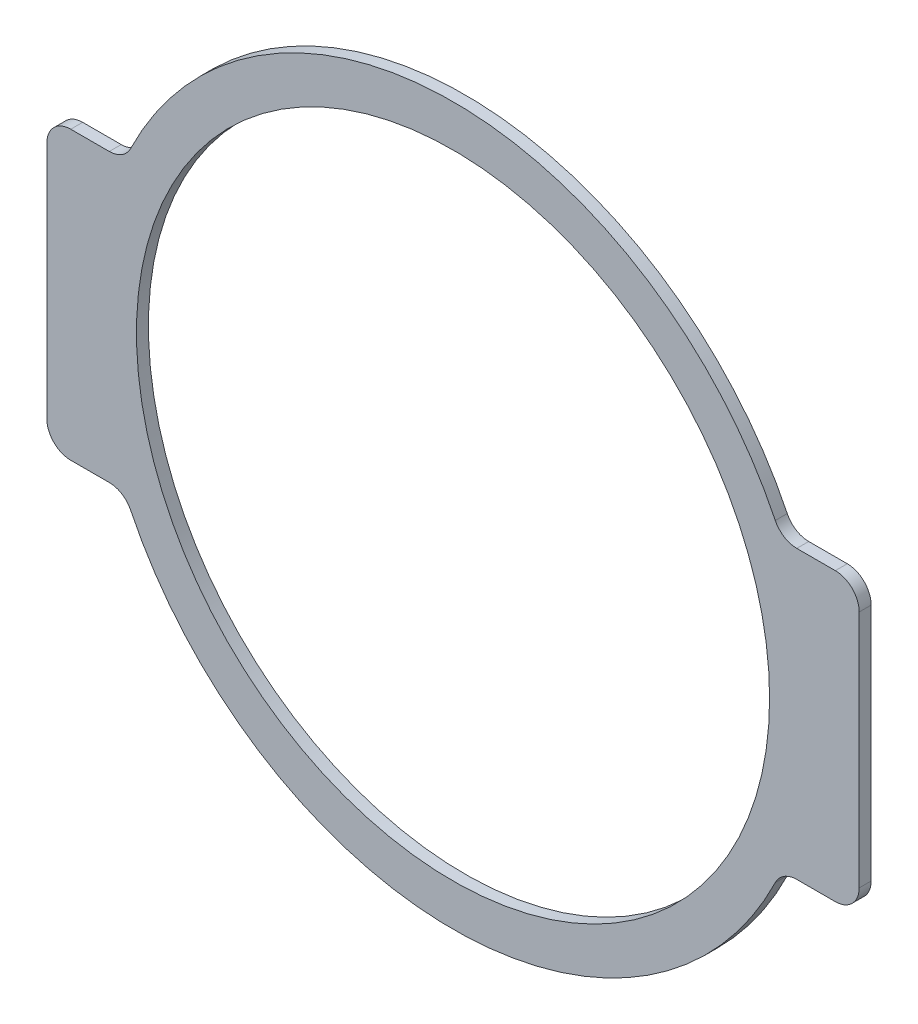
ISO-10303-21;
HEADER;
FILE_DESCRIPTION(('STEP AP214'),'2;1');
FILE_NAME('part.step','',(''),(''),'','','');
FILE_SCHEMA(('AUTOMOTIVE_DESIGN { 1 0 10303 214 1 1 1 1 }'));
ENDSEC;
DATA;
#1=APPLICATION_CONTEXT('core data for automotive mechanical design processes');
#2=APPLICATION_PROTOCOL_DEFINITION('international standard','automotive_design',2000,#1);
#3=PRODUCT_CONTEXT('',#1,'mechanical');
#4=PRODUCT('Part','Part','',(#3));
#5=PRODUCT_RELATED_PRODUCT_CATEGORY('part','',(#4));
#6=PRODUCT_DEFINITION_FORMATION('','',#4);
#7=PRODUCT_DEFINITION_CONTEXT('part definition',#1,'design');
#8=PRODUCT_DEFINITION('design','',#6,#7);
#9=PRODUCT_DEFINITION_SHAPE('','',#8);
#10=(LENGTH_UNIT() NAMED_UNIT(*) SI_UNIT(.MILLI.,.METRE.));
#11=(NAMED_UNIT(*) PLANE_ANGLE_UNIT() SI_UNIT($,.RADIAN.));
#12=(NAMED_UNIT(*) SI_UNIT($,.STERADIAN.) SOLID_ANGLE_UNIT());
#13=UNCERTAINTY_MEASURE_WITH_UNIT(LENGTH_MEASURE(1.E-05),#10,'distance_accuracy_value','');
#14=(GEOMETRIC_REPRESENTATION_CONTEXT(3) GLOBAL_UNCERTAINTY_ASSIGNED_CONTEXT((#13)) GLOBAL_UNIT_ASSIGNED_CONTEXT((#10,
#11,#12)) REPRESENTATION_CONTEXT('',''));
#15=CARTESIAN_POINT('',(0.,0.,0.));
#16=DIRECTION('',(0.,0.,1.));
#17=DIRECTION('',(1.,0.,0.));
#18=AXIS2_PLACEMENT_3D('',#15,#16,#17);
#19=CARTESIAN_POINT('',(-160.,49.9999999999999,5.));
#20=DIRECTION('',(0.,0.,1.));
#21=DIRECTION('',(1.,0.,0.));
#22=AXIS2_PLACEMENT_3D('',#19,#20,#21);
#23=PLANE('',#22);
#24=CARTESIAN_POINT('',(-160.,49.9999999999999,5.));
#25=DIRECTION('',(0.,0.,1.));
#26=DIRECTION('',(1.,0.,0.));
#27=AXIS2_PLACEMENT_3D('',#24,#25,#26);
#28=CIRCLE('',#27,10.);
#29=CARTESIAN_POINT('',(-160.,59.9999999999999,5.));
#30=VERTEX_POINT('',#29);
#31=CARTESIAN_POINT('',(-170.,49.9999999999999,5.));
#32=VERTEX_POINT('',#31);
#33=EDGE_CURVE('E212',#30,#32,#28,.T.);
#34=ORIENTED_EDGE('',*,*,#33,.T.);
#35=DIRECTION('',(0.,-1.,0.));
#36=VECTOR('',#35,1.);
#37=CARTESIAN_POINT('',(-170.,49.9999999999999,5.));
#38=LINE('',#37,#36);
#39=CARTESIAN_POINT('',(-170.,-50.0000000000001,5.));
#40=VERTEX_POINT('',#39);
#41=EDGE_CURVE('E119',#32,#40,#38,.T.);
#42=ORIENTED_EDGE('',*,*,#41,.T.);
#43=CARTESIAN_POINT('',(-160.,-50.0000000000001,5.));
#44=DIRECTION('',(0.,0.,1.));
#45=DIRECTION('',(1.,0.,0.));
#46=AXIS2_PLACEMENT_3D('',#43,#44,#45);
#47=CIRCLE('',#46,10.);
#48=CARTESIAN_POINT('',(-160.,-60.0000000000001,5.));
#49=VERTEX_POINT('',#48);
#50=EDGE_CURVE('E251',#40,#49,#47,.T.);
#51=ORIENTED_EDGE('',*,*,#50,.T.);
#52=DIRECTION('',(1.,0.,0.));
#53=VECTOR('',#52,1.);
#54=CARTESIAN_POINT('',(-160.,-60.0000000000001,5.));
#55=LINE('',#54,#53);
#56=CARTESIAN_POINT('',(-143.874945699382,-60.0000000000001,5.));
#57=VERTEX_POINT('',#56);
#58=EDGE_CURVE('E269',#49,#57,#55,.T.);
#59=ORIENTED_EDGE('',*,*,#58,.T.);
#60=CARTESIAN_POINT('',(-143.874945699382,-70.0000000000001,5.));
#61=DIRECTION('',(0.,0.,-1.));
#62=DIRECTION('',(1.,0.,0.));
#63=AXIS2_PLACEMENT_3D('',#60,#61,#62);
#64=CIRCLE('',#63,10.);
#65=CARTESIAN_POINT('',(-134.88276159317,-65.6250000000001,5.));
#66=VERTEX_POINT('',#65);
#67=EDGE_CURVE('E266',#57,#66,#64,.T.);
#68=ORIENTED_EDGE('',*,*,#67,.T.);
#69=CARTESIAN_POINT('',(0.,0.,5.));
#70=DIRECTION('',(0.,0.,1.));
#71=DIRECTION('',(1.,0.,0.));
#72=AXIS2_PLACEMENT_3D('',#69,#70,#71);
#73=CIRCLE('',#72,150.);
#74=CARTESIAN_POINT('',(134.88276159317,-65.625,5.));
#75=VERTEX_POINT('',#74);
#76=EDGE_CURVE('E268',#66,#75,#73,.T.);
#77=ORIENTED_EDGE('',*,*,#76,.T.);
#78=CARTESIAN_POINT('',(143.874945699382,-69.9999999999999,5.));
#79=DIRECTION('',(0.,0.,-1.));
#80=DIRECTION('',(1.,0.,0.));
#81=AXIS2_PLACEMENT_3D('',#78,#79,#80);
#82=CIRCLE('',#81,10.);
#83=CARTESIAN_POINT('',(143.874945699382,-59.9999999999999,5.));
#84=VERTEX_POINT('',#83);
#85=EDGE_CURVE('E271',#75,#84,#82,.T.);
#86=ORIENTED_EDGE('',*,*,#85,.T.);
#87=DIRECTION('',(1.,0.,0.));
#88=VECTOR('',#87,1.);
#89=CARTESIAN_POINT('',(143.874945699382,-59.9999999999999,5.));
#90=LINE('',#89,#88);
#91=CARTESIAN_POINT('',(160.,-59.9999999999999,5.));
#92=VERTEX_POINT('',#91);
#93=EDGE_CURVE('E277',#84,#92,#90,.T.);
#94=ORIENTED_EDGE('',*,*,#93,.T.);
#95=CARTESIAN_POINT('',(160.,-49.9999999999999,5.));
#96=DIRECTION('',(0.,0.,1.));
#97=DIRECTION('',(1.,0.,0.));
#98=AXIS2_PLACEMENT_3D('',#95,#96,#97);
#99=CIRCLE('',#98,10.);
#100=CARTESIAN_POINT('',(170.,-49.9999999999999,5.));
#101=VERTEX_POINT('',#100);
#102=EDGE_CURVE('E279',#92,#101,#99,.T.);
#103=ORIENTED_EDGE('',*,*,#102,.T.);
#104=DIRECTION('',(0.,1.,0.));
#105=VECTOR('',#104,1.);
#106=CARTESIAN_POINT('',(170.,-49.9999999999999,5.));
#107=LINE('',#106,#105);
#108=CARTESIAN_POINT('',(170.,50.0000000000001,5.));
#109=VERTEX_POINT('',#108);
#110=EDGE_CURVE('E281',#101,#109,#107,.T.);
#111=ORIENTED_EDGE('',*,*,#110,.T.);
#112=CARTESIAN_POINT('',(160.,50.0000000000001,5.));
#113=DIRECTION('',(0.,0.,1.));
#114=DIRECTION('',(1.,0.,0.));
#115=AXIS2_PLACEMENT_3D('',#112,#113,#114);
#116=CIRCLE('',#115,10.);
#117=CARTESIAN_POINT('',(160.,60.0000000000001,5.));
#118=VERTEX_POINT('',#117);
#119=EDGE_CURVE('E283',#109,#118,#116,.T.);
#120=ORIENTED_EDGE('',*,*,#119,.T.);
#121=DIRECTION('',(-1.,0.,0.));
#122=VECTOR('',#121,1.);
#123=CARTESIAN_POINT('',(160.,60.0000000000001,5.));
#124=LINE('',#123,#122);
#125=CARTESIAN_POINT('',(143.874945699382,60.0000000000001,5.));
#126=VERTEX_POINT('',#125);
#127=EDGE_CURVE('E285',#118,#126,#124,.T.);
#128=ORIENTED_EDGE('',*,*,#127,.T.);
#129=CARTESIAN_POINT('',(143.874945699382,70.0000000000001,5.));
#130=DIRECTION('',(0.,0.,-1.));
#131=DIRECTION('',(1.,0.,0.));
#132=AXIS2_PLACEMENT_3D('',#129,#130,#131);
#133=CIRCLE('',#132,10.);
#134=CARTESIAN_POINT('',(134.88276159317,65.6250000000001,5.));
#135=VERTEX_POINT('',#134);
#136=EDGE_CURVE('E162',#126,#135,#133,.T.);
#137=ORIENTED_EDGE('',*,*,#136,.T.);
#138=CARTESIAN_POINT('',(0.,0.,5.));
#139=DIRECTION('',(0.,0.,1.));
#140=DIRECTION('',(1.,0.,0.));
#141=AXIS2_PLACEMENT_3D('',#138,#139,#140);
#142=CIRCLE('',#141,150.);
#143=CARTESIAN_POINT('',(-134.88276159317,65.6249999999999,5.));
#144=VERTEX_POINT('',#143);
#145=EDGE_CURVE('E156',#135,#144,#142,.T.);
#146=ORIENTED_EDGE('',*,*,#145,.T.);
#147=CARTESIAN_POINT('',(-143.874945699382,69.9999999999999,5.));
#148=DIRECTION('',(0.,0.,-1.));
#149=DIRECTION('',(1.,0.,0.));
#150=AXIS2_PLACEMENT_3D('',#147,#148,#149);
#151=CIRCLE('',#150,10.);
#152=CARTESIAN_POINT('',(-143.874945699382,59.9999999999999,5.));
#153=VERTEX_POINT('',#152);
#154=EDGE_CURVE('E160',#144,#153,#151,.T.);
#155=ORIENTED_EDGE('',*,*,#154,.T.);
#156=DIRECTION('',(-1.,0.,0.));
#157=VECTOR('',#156,1.);
#158=CARTESIAN_POINT('',(-143.874945699382,59.9999999999999,5.));
#159=LINE('',#158,#157);
#160=EDGE_CURVE('E52',#153,#30,#159,.T.);
#161=ORIENTED_EDGE('',*,*,#160,.T.);
#162=EDGE_LOOP('',(#34,#42,#51,#59,#68,#77,#86,#94,#103,#111,#120,#128,#137,#146,#155,#161));
#163=FACE_BOUND('',#162,.T.);
#164=CARTESIAN_POINT('',(0.,0.,5.));
#165=DIRECTION('',(0.,0.,1.));
#166=DIRECTION('',(1.,0.,0.));
#167=AXIS2_PLACEMENT_3D('',#164,#165,#166);
#168=CIRCLE('',#167,132.5);
#169=CARTESIAN_POINT('',(132.5,0.,5.));
#170=VERTEX_POINT('',#169);
#171=EDGE_CURVE('E184',#170,#170,#168,.T.);
#172=ORIENTED_EDGE('',*,*,#171,.F.);
#173=EDGE_LOOP('',(#172));
#174=FACE_BOUND('',#173,.T.);
#175=ADVANCED_FACE('F35',(#163,#174),#23,.T.);
#176=CARTESIAN_POINT('',(-160.,49.9999999999999,0.));
#177=DIRECTION('',(0.,0.,1.));
#178=DIRECTION('',(1.,0.,0.));
#179=AXIS2_PLACEMENT_3D('',#176,#177,#178);
#180=PLANE('',#179);
#181=CARTESIAN_POINT('',(-160.,49.9999999999999,0.));
#182=DIRECTION('',(0.,0.,1.));
#183=DIRECTION('',(1.,0.,0.));
#184=AXIS2_PLACEMENT_3D('',#181,#182,#183);
#185=CIRCLE('',#184,10.);
#186=CARTESIAN_POINT('',(-160.,59.9999999999999,0.));
#187=VERTEX_POINT('',#186);
#188=CARTESIAN_POINT('',(-170.,49.9999999999999,0.));
#189=VERTEX_POINT('',#188);
#190=EDGE_CURVE('E180',#187,#189,#185,.T.);
#191=ORIENTED_EDGE('',*,*,#190,.F.);
#192=DIRECTION('',(-1.,0.,0.));
#193=VECTOR('',#192,1.);
#194=CARTESIAN_POINT('',(-143.874945699382,59.9999999999999,0.));
#195=LINE('',#194,#193);
#196=CARTESIAN_POINT('',(-143.874945699382,59.9999999999999,0.));
#197=VERTEX_POINT('',#196);
#198=EDGE_CURVE('E111',#197,#187,#195,.T.);
#199=ORIENTED_EDGE('',*,*,#198,.F.);
#200=CARTESIAN_POINT('',(-143.874945699382,69.9999999999999,0.));
#201=DIRECTION('',(0.,0.,-1.));
#202=DIRECTION('',(1.,0.,0.));
#203=AXIS2_PLACEMENT_3D('',#200,#201,#202);
#204=CIRCLE('',#203,10.);
#205=CARTESIAN_POINT('',(-134.88276159317,65.6249999999999,0.));
#206=VERTEX_POINT('',#205);
#207=EDGE_CURVE('E105',#206,#197,#204,.T.);
#208=ORIENTED_EDGE('',*,*,#207,.F.);
#209=CARTESIAN_POINT('',(0.,0.,0.));
#210=DIRECTION('',(0.,0.,1.));
#211=DIRECTION('',(1.,0.,0.));
#212=AXIS2_PLACEMENT_3D('',#209,#210,#211);
#213=CIRCLE('',#212,150.);
#214=CARTESIAN_POINT('',(134.88276159317,65.6250000000001,0.));
#215=VERTEX_POINT('',#214);
#216=EDGE_CURVE('E170',#215,#206,#213,.T.);
#217=ORIENTED_EDGE('',*,*,#216,.F.);
#218=CARTESIAN_POINT('',(143.874945699382,70.0000000000001,0.));
#219=DIRECTION('',(0.,0.,-1.));
#220=DIRECTION('',(1.,0.,0.));
#221=AXIS2_PLACEMENT_3D('',#218,#219,#220);
#222=CIRCLE('',#221,10.);
#223=CARTESIAN_POINT('',(143.874945699382,60.0000000000001,0.));
#224=VERTEX_POINT('',#223);
#225=EDGE_CURVE('E207',#224,#215,#222,.T.);
#226=ORIENTED_EDGE('',*,*,#225,.F.);
#227=DIRECTION('',(-1.,0.,0.));
#228=VECTOR('',#227,1.);
#229=CARTESIAN_POINT('',(160.,60.0000000000001,0.));
#230=LINE('',#229,#228);
#231=CARTESIAN_POINT('',(160.,60.0000000000001,0.));
#232=VERTEX_POINT('',#231);
#233=EDGE_CURVE('E205',#232,#224,#230,.T.);
#234=ORIENTED_EDGE('',*,*,#233,.F.);
#235=CARTESIAN_POINT('',(160.,50.0000000000001,0.));
#236=DIRECTION('',(0.,0.,1.));
#237=DIRECTION('',(1.,0.,0.));
#238=AXIS2_PLACEMENT_3D('',#235,#236,#237);
#239=CIRCLE('',#238,10.);
#240=CARTESIAN_POINT('',(170.,50.0000000000001,0.));
#241=VERTEX_POINT('',#240);
#242=EDGE_CURVE('E203',#241,#232,#239,.T.);
#243=ORIENTED_EDGE('',*,*,#242,.F.);
#244=DIRECTION('',(0.,1.,0.));
#245=VECTOR('',#244,1.);
#246=CARTESIAN_POINT('',(170.,-49.9999999999999,0.));
#247=LINE('',#246,#245);
#248=CARTESIAN_POINT('',(170.,-49.9999999999999,0.));
#249=VERTEX_POINT('',#248);
#250=EDGE_CURVE('E201',#249,#241,#247,.T.);
#251=ORIENTED_EDGE('',*,*,#250,.F.);
#252=CARTESIAN_POINT('',(160.,-49.9999999999999,0.));
#253=DIRECTION('',(0.,0.,1.));
#254=DIRECTION('',(1.,0.,0.));
#255=AXIS2_PLACEMENT_3D('',#252,#253,#254);
#256=CIRCLE('',#255,10.);
#257=CARTESIAN_POINT('',(160.,-59.9999999999999,0.));
#258=VERTEX_POINT('',#257);
#259=EDGE_CURVE('E199',#258,#249,#256,.T.);
#260=ORIENTED_EDGE('',*,*,#259,.F.);
#261=DIRECTION('',(1.,0.,0.));
#262=VECTOR('',#261,1.);
#263=CARTESIAN_POINT('',(143.874945699382,-59.9999999999999,0.));
#264=LINE('',#263,#262);
#265=CARTESIAN_POINT('',(143.874945699382,-59.9999999999999,0.));
#266=VERTEX_POINT('',#265);
#267=EDGE_CURVE('E197',#266,#258,#264,.T.);
#268=ORIENTED_EDGE('',*,*,#267,.F.);
#269=CARTESIAN_POINT('',(143.874945699382,-69.9999999999999,0.));
#270=DIRECTION('',(0.,0.,-1.));
#271=DIRECTION('',(1.,0.,0.));
#272=AXIS2_PLACEMENT_3D('',#269,#270,#271);
#273=CIRCLE('',#272,10.);
#274=CARTESIAN_POINT('',(134.88276159317,-65.625,0.));
#275=VERTEX_POINT('',#274);
#276=EDGE_CURVE('E195',#275,#266,#273,.T.);
#277=ORIENTED_EDGE('',*,*,#276,.F.);
#278=CARTESIAN_POINT('',(0.,0.,0.));
#279=DIRECTION('',(0.,0.,1.));
#280=DIRECTION('',(1.,0.,0.));
#281=AXIS2_PLACEMENT_3D('',#278,#279,#280);
#282=CIRCLE('',#281,150.);
#283=CARTESIAN_POINT('',(-134.88276159317,-65.6250000000001,0.));
#284=VERTEX_POINT('',#283);
#285=EDGE_CURVE('E193',#284,#275,#282,.T.);
#286=ORIENTED_EDGE('',*,*,#285,.F.);
#287=CARTESIAN_POINT('',(-143.874945699382,-70.0000000000001,0.));
#288=DIRECTION('',(0.,0.,-1.));
#289=DIRECTION('',(1.,0.,0.));
#290=AXIS2_PLACEMENT_3D('',#287,#288,#289);
#291=CIRCLE('',#290,10.);
#292=CARTESIAN_POINT('',(-143.874945699382,-60.0000000000001,0.));
#293=VERTEX_POINT('',#292);
#294=EDGE_CURVE('E190',#293,#284,#291,.T.);
#295=ORIENTED_EDGE('',*,*,#294,.F.);
#296=DIRECTION('',(1.,0.,0.));
#297=VECTOR('',#296,1.);
#298=CARTESIAN_POINT('',(-160.,-60.0000000000001,0.));
#299=LINE('',#298,#297);
#300=CARTESIAN_POINT('',(-160.,-60.0000000000001,0.));
#301=VERTEX_POINT('',#300);
#302=EDGE_CURVE('E188',#301,#293,#299,.T.);
#303=ORIENTED_EDGE('',*,*,#302,.F.);
#304=CARTESIAN_POINT('',(-160.,-50.0000000000001,0.));
#305=DIRECTION('',(0.,0.,1.));
#306=DIRECTION('',(1.,0.,0.));
#307=AXIS2_PLACEMENT_3D('',#304,#305,#306);
#308=CIRCLE('',#307,10.);
#309=CARTESIAN_POINT('',(-170.,-50.0000000000001,0.));
#310=VERTEX_POINT('',#309);
#311=EDGE_CURVE('E186',#310,#301,#308,.T.);
#312=ORIENTED_EDGE('',*,*,#311,.F.);
#313=DIRECTION('',(0.,-1.,0.));
#314=VECTOR('',#313,1.);
#315=CARTESIAN_POINT('',(-170.,49.9999999999999,0.));
#316=LINE('',#315,#314);
#317=EDGE_CURVE('E183',#189,#310,#316,.T.);
#318=ORIENTED_EDGE('',*,*,#317,.F.);
#319=EDGE_LOOP('',(#191,#199,#208,#217,#226,#234,#243,#251,#260,#268,#277,#286,#295,#303,#312,#318));
#320=FACE_BOUND('',#319,.T.);
#321=CARTESIAN_POINT('',(0.,0.,0.));
#322=DIRECTION('',(0.,0.,1.));
#323=DIRECTION('',(1.,0.,0.));
#324=AXIS2_PLACEMENT_3D('',#321,#322,#323);
#325=CIRCLE('',#324,132.5);
#326=CARTESIAN_POINT('',(132.5,0.,0.));
#327=VERTEX_POINT('',#326);
#328=EDGE_CURVE('E488',#327,#327,#325,.T.);
#329=ORIENTED_EDGE('',*,*,#328,.T.);
#330=EDGE_LOOP('',(#329));
#331=FACE_BOUND('',#330,.T.);
#332=ADVANCED_FACE('F255',(#320,#331),#180,.F.);
#333=CARTESIAN_POINT('',(-160.,49.9999999999999,5.));
#334=DIRECTION('',(0.,0.,-1.));
#335=DIRECTION('',(-1.,0.,0.));
#336=AXIS2_PLACEMENT_3D('',#333,#334,#335);
#337=CYLINDRICAL_SURFACE('',#336,10.);
#338=ORIENTED_EDGE('',*,*,#190,.T.);
#339=DIRECTION('',(0.,0.,-1.));
#340=VECTOR('',#339,1.);
#341=CARTESIAN_POINT('',(-170.,49.9999999999999,5.));
#342=LINE('',#341,#340);
#343=EDGE_CURVE('E11',#32,#189,#342,.T.);
#344=ORIENTED_EDGE('',*,*,#343,.F.);
#345=ORIENTED_EDGE('',*,*,#33,.F.);
#346=DIRECTION('',(0.,0.,-1.));
#347=VECTOR('',#346,1.);
#348=CARTESIAN_POINT('',(-160.,59.9999999999999,5.));
#349=LINE('',#348,#347);
#350=EDGE_CURVE('E176',#30,#187,#349,.T.);
#351=ORIENTED_EDGE('',*,*,#350,.T.);
#352=EDGE_LOOP('',(#338,#344,#345,#351));
#353=FACE_BOUND('',#352,.T.);
#354=ADVANCED_FACE('F37',(#353),#337,.T.);
#355=CARTESIAN_POINT('',(-170.,49.9999999999999,5.));
#356=DIRECTION('',(1.,0.,0.));
#357=DIRECTION('',(0.,1.,0.));
#358=AXIS2_PLACEMENT_3D('',#355,#356,#357);
#359=PLANE('',#358);
#360=ORIENTED_EDGE('',*,*,#317,.T.);
#361=DIRECTION('',(0.,0.,-1.));
#362=VECTOR('',#361,1.);
#363=CARTESIAN_POINT('',(-170.,-50.0000000000001,5.));
#364=LINE('',#363,#362);
#365=EDGE_CURVE('E44',#40,#310,#364,.T.);
#366=ORIENTED_EDGE('',*,*,#365,.F.);
#367=ORIENTED_EDGE('',*,*,#41,.F.);
#368=ORIENTED_EDGE('',*,*,#343,.T.);
#369=EDGE_LOOP('',(#360,#366,#367,#368));
#370=FACE_BOUND('',#369,.T.);
#371=ADVANCED_FACE('F319',(#370),#359,.F.);
#372=CARTESIAN_POINT('',(-160.,-50.0000000000001,5.));
#373=DIRECTION('',(0.,0.,-1.));
#374=DIRECTION('',(-1.,0.,0.));
#375=AXIS2_PLACEMENT_3D('',#372,#373,#374);
#376=CYLINDRICAL_SURFACE('',#375,10.);
#377=ORIENTED_EDGE('',*,*,#311,.T.);
#378=DIRECTION('',(0.,0.,-1.));
#379=VECTOR('',#378,1.);
#380=CARTESIAN_POINT('',(-160.,-60.0000000000001,5.));
#381=LINE('',#380,#379);
#382=EDGE_CURVE('E243',#49,#301,#381,.T.);
#383=ORIENTED_EDGE('',*,*,#382,.F.);
#384=ORIENTED_EDGE('',*,*,#50,.F.);
#385=ORIENTED_EDGE('',*,*,#365,.T.);
#386=EDGE_LOOP('',(#377,#383,#384,#385));
#387=FACE_BOUND('',#386,.T.);
#388=ADVANCED_FACE('F249',(#387),#376,.T.);
#389=CARTESIAN_POINT('',(-160.,-60.0000000000001,5.));
#390=DIRECTION('',(0.,1.,0.));
#391=DIRECTION('',(-1.,0.,0.));
#392=AXIS2_PLACEMENT_3D('',#389,#390,#391);
#393=PLANE('',#392);
#394=ORIENTED_EDGE('',*,*,#302,.T.);
#395=DIRECTION('',(0.,0.,-1.));
#396=VECTOR('',#395,1.);
#397=CARTESIAN_POINT('',(-143.874945699382,-60.0000000000001,5.));
#398=LINE('',#397,#396);
#399=EDGE_CURVE('E240',#57,#293,#398,.T.);
#400=ORIENTED_EDGE('',*,*,#399,.F.);
#401=ORIENTED_EDGE('',*,*,#58,.F.);
#402=ORIENTED_EDGE('',*,*,#382,.T.);
#403=EDGE_LOOP('',(#394,#400,#401,#402));
#404=FACE_BOUND('',#403,.T.);
#405=ADVANCED_FACE('F260',(#404),#393,.F.);
#406=CARTESIAN_POINT('',(-143.874945699382,-70.0000000000001,5.));
#407=DIRECTION('',(0.,0.,-1.));
#408=DIRECTION('',(-1.,0.,0.));
#409=AXIS2_PLACEMENT_3D('',#406,#407,#408);
#410=CYLINDRICAL_SURFACE('',#409,10.);
#411=ORIENTED_EDGE('',*,*,#294,.T.);
#412=DIRECTION('',(0.,0.,-1.));
#413=VECTOR('',#412,1.);
#414=CARTESIAN_POINT('',(-134.88276159317,-65.6250000000001,5.));
#415=LINE('',#414,#413);
#416=EDGE_CURVE('E237',#66,#284,#415,.T.);
#417=ORIENTED_EDGE('',*,*,#416,.F.);
#418=ORIENTED_EDGE('',*,*,#67,.F.);
#419=ORIENTED_EDGE('',*,*,#399,.T.);
#420=EDGE_LOOP('',(#411,#417,#418,#419));
#421=FACE_BOUND('',#420,.T.);
#422=ADVANCED_FACE('F264',(#421),#410,.F.);
#423=CARTESIAN_POINT('',(0.,0.,5.));
#424=DIRECTION('',(0.,0.,-1.));
#425=DIRECTION('',(-1.,0.,0.));
#426=AXIS2_PLACEMENT_3D('',#423,#424,#425);
#427=CYLINDRICAL_SURFACE('',#426,150.);
#428=ORIENTED_EDGE('',*,*,#285,.T.);
#429=DIRECTION('',(0.,0.,-1.));
#430=VECTOR('',#429,1.);
#431=CARTESIAN_POINT('',(134.88276159317,-65.625,5.));
#432=LINE('',#431,#430);
#433=EDGE_CURVE('E234',#75,#275,#432,.T.);
#434=ORIENTED_EDGE('',*,*,#433,.F.);
#435=ORIENTED_EDGE('',*,*,#76,.F.);
#436=ORIENTED_EDGE('',*,*,#416,.T.);
#437=EDGE_LOOP('',(#428,#434,#435,#436));
#438=FACE_BOUND('',#437,.T.);
#439=ADVANCED_FACE('F332',(#438),#427,.T.);
#440=CARTESIAN_POINT('',(143.874945699382,-69.9999999999999,5.));
#441=DIRECTION('',(0.,0.,-1.));
#442=DIRECTION('',(-1.,0.,0.));
#443=AXIS2_PLACEMENT_3D('',#440,#441,#442);
#444=CYLINDRICAL_SURFACE('',#443,10.);
#445=ORIENTED_EDGE('',*,*,#276,.T.);
#446=DIRECTION('',(0.,0.,-1.));
#447=VECTOR('',#446,1.);
#448=CARTESIAN_POINT('',(143.874945699382,-59.9999999999999,5.));
#449=LINE('',#448,#447);
#450=EDGE_CURVE('E231',#84,#266,#449,.T.);
#451=ORIENTED_EDGE('',*,*,#450,.F.);
#452=ORIENTED_EDGE('',*,*,#85,.F.);
#453=ORIENTED_EDGE('',*,*,#433,.T.);
#454=EDGE_LOOP('',(#445,#451,#452,#453));
#455=FACE_BOUND('',#454,.T.);
#456=ADVANCED_FACE('F335',(#455),#444,.F.);
#457=CARTESIAN_POINT('',(143.874945699382,-59.9999999999999,5.));
#458=DIRECTION('',(0.,1.,0.));
#459=DIRECTION('',(-1.,0.,0.));
#460=AXIS2_PLACEMENT_3D('',#457,#458,#459);
#461=PLANE('',#460);
#462=ORIENTED_EDGE('',*,*,#267,.T.);
#463=DIRECTION('',(0.,0.,-1.));
#464=VECTOR('',#463,1.);
#465=CARTESIAN_POINT('',(160.,-59.9999999999999,5.));
#466=LINE('',#465,#464);
#467=EDGE_CURVE('E228',#92,#258,#466,.T.);
#468=ORIENTED_EDGE('',*,*,#467,.F.);
#469=ORIENTED_EDGE('',*,*,#93,.F.);
#470=ORIENTED_EDGE('',*,*,#450,.T.);
#471=EDGE_LOOP('',(#462,#468,#469,#470));
#472=FACE_BOUND('',#471,.T.);
#473=ADVANCED_FACE('F339',(#472),#461,.F.);
#474=CARTESIAN_POINT('',(160.,-49.9999999999999,5.));
#475=DIRECTION('',(0.,0.,-1.));
#476=DIRECTION('',(-1.,0.,0.));
#477=AXIS2_PLACEMENT_3D('',#474,#475,#476);
#478=CYLINDRICAL_SURFACE('',#477,10.);
#479=ORIENTED_EDGE('',*,*,#259,.T.);
#480=DIRECTION('',(0.,0.,-1.));
#481=VECTOR('',#480,1.);
#482=CARTESIAN_POINT('',(170.,-49.9999999999999,5.));
#483=LINE('',#482,#481);
#484=EDGE_CURVE('E225',#101,#249,#483,.T.);
#485=ORIENTED_EDGE('',*,*,#484,.F.);
#486=ORIENTED_EDGE('',*,*,#102,.F.);
#487=ORIENTED_EDGE('',*,*,#467,.T.);
#488=EDGE_LOOP('',(#479,#485,#486,#487));
#489=FACE_BOUND('',#488,.T.);
#490=ADVANCED_FACE('F343',(#489),#478,.T.);
#491=CARTESIAN_POINT('',(170.,-49.9999999999999,5.));
#492=DIRECTION('',(-1.,0.,0.));
#493=DIRECTION('',(0.,-1.,0.));
#494=AXIS2_PLACEMENT_3D('',#491,#492,#493);
#495=PLANE('',#494);
#496=ORIENTED_EDGE('',*,*,#250,.T.);
#497=DIRECTION('',(0.,0.,-1.));
#498=VECTOR('',#497,1.);
#499=CARTESIAN_POINT('',(170.,50.0000000000001,5.));
#500=LINE('',#499,#498);
#501=EDGE_CURVE('E222',#109,#241,#500,.T.);
#502=ORIENTED_EDGE('',*,*,#501,.F.);
#503=ORIENTED_EDGE('',*,*,#110,.F.);
#504=ORIENTED_EDGE('',*,*,#484,.T.);
#505=EDGE_LOOP('',(#496,#502,#503,#504));
#506=FACE_BOUND('',#505,.T.);
#507=ADVANCED_FACE('F347',(#506),#495,.F.);
#508=CARTESIAN_POINT('',(160.,50.0000000000001,5.));
#509=DIRECTION('',(0.,0.,-1.));
#510=DIRECTION('',(-1.,0.,0.));
#511=AXIS2_PLACEMENT_3D('',#508,#509,#510);
#512=CYLINDRICAL_SURFACE('',#511,10.);
#513=ORIENTED_EDGE('',*,*,#242,.T.);
#514=DIRECTION('',(0.,0.,-1.));
#515=VECTOR('',#514,1.);
#516=CARTESIAN_POINT('',(160.,60.0000000000001,5.));
#517=LINE('',#516,#515);
#518=EDGE_CURVE('E219',#118,#232,#517,.T.);
#519=ORIENTED_EDGE('',*,*,#518,.F.);
#520=ORIENTED_EDGE('',*,*,#119,.F.);
#521=ORIENTED_EDGE('',*,*,#501,.T.);
#522=EDGE_LOOP('',(#513,#519,#520,#521));
#523=FACE_BOUND('',#522,.T.);
#524=ADVANCED_FACE('F351',(#523),#512,.T.);
#525=CARTESIAN_POINT('',(160.,60.0000000000001,5.));
#526=DIRECTION('',(0.,-1.,0.));
#527=DIRECTION('',(1.,0.,0.));
#528=AXIS2_PLACEMENT_3D('',#525,#526,#527);
#529=PLANE('',#528);
#530=ORIENTED_EDGE('',*,*,#233,.T.);
#531=DIRECTION('',(0.,0.,-1.));
#532=VECTOR('',#531,1.);
#533=CARTESIAN_POINT('',(143.874945699382,60.0000000000001,5.));
#534=LINE('',#533,#532);
#535=EDGE_CURVE('E216',#126,#224,#534,.T.);
#536=ORIENTED_EDGE('',*,*,#535,.F.);
#537=ORIENTED_EDGE('',*,*,#127,.F.);
#538=ORIENTED_EDGE('',*,*,#518,.T.);
#539=EDGE_LOOP('',(#530,#536,#537,#538));
#540=FACE_BOUND('',#539,.T.);
#541=ADVANCED_FACE('F291',(#540),#529,.F.);
#542=CARTESIAN_POINT('',(143.874945699382,70.0000000000001,5.));
#543=DIRECTION('',(0.,0.,-1.));
#544=DIRECTION('',(-1.,0.,0.));
#545=AXIS2_PLACEMENT_3D('',#542,#543,#544);
#546=CYLINDRICAL_SURFACE('',#545,10.);
#547=ORIENTED_EDGE('',*,*,#225,.T.);
#548=DIRECTION('',(0.,0.,-1.));
#549=VECTOR('',#548,1.);
#550=CARTESIAN_POINT('',(134.88276159317,65.6250000000001,5.));
#551=LINE('',#550,#549);
#552=EDGE_CURVE('E171',#135,#215,#551,.T.);
#553=ORIENTED_EDGE('',*,*,#552,.F.);
#554=ORIENTED_EDGE('',*,*,#136,.F.);
#555=ORIENTED_EDGE('',*,*,#535,.T.);
#556=EDGE_LOOP('',(#547,#553,#554,#555));
#557=FACE_BOUND('',#556,.T.);
#558=ADVANCED_FACE('F295',(#557),#546,.F.);
#559=CARTESIAN_POINT('',(0.,0.,5.));
#560=DIRECTION('',(0.,0.,-1.));
#561=DIRECTION('',(-1.,0.,0.));
#562=AXIS2_PLACEMENT_3D('',#559,#560,#561);
#563=CYLINDRICAL_SURFACE('',#562,150.);
#564=ORIENTED_EDGE('',*,*,#216,.T.);
#565=DIRECTION('',(0.,0.,-1.));
#566=VECTOR('',#565,1.);
#567=CARTESIAN_POINT('',(-134.88276159317,65.6249999999999,5.));
#568=LINE('',#567,#566);
#569=EDGE_CURVE('E167',#144,#206,#568,.T.);
#570=ORIENTED_EDGE('',*,*,#569,.F.);
#571=ORIENTED_EDGE('',*,*,#145,.F.);
#572=ORIENTED_EDGE('',*,*,#552,.T.);
#573=EDGE_LOOP('',(#564,#570,#571,#572));
#574=FACE_BOUND('',#573,.T.);
#575=ADVANCED_FACE('F168',(#574),#563,.T.);
#576=CARTESIAN_POINT('',(-143.874945699382,69.9999999999999,5.));
#577=DIRECTION('',(0.,0.,-1.));
#578=DIRECTION('',(-1.,0.,0.));
#579=AXIS2_PLACEMENT_3D('',#576,#577,#578);
#580=CYLINDRICAL_SURFACE('',#579,10.);
#581=ORIENTED_EDGE('',*,*,#207,.T.);
#582=DIRECTION('',(0.,0.,-1.));
#583=VECTOR('',#582,1.);
#584=CARTESIAN_POINT('',(-143.874945699382,59.9999999999999,5.));
#585=LINE('',#584,#583);
#586=EDGE_CURVE('E172',#153,#197,#585,.T.);
#587=ORIENTED_EDGE('',*,*,#586,.F.);
#588=ORIENTED_EDGE('',*,*,#154,.F.);
#589=ORIENTED_EDGE('',*,*,#569,.T.);
#590=EDGE_LOOP('',(#581,#587,#588,#589));
#591=FACE_BOUND('',#590,.T.);
#592=ADVANCED_FACE('F174',(#591),#580,.F.);
#593=CARTESIAN_POINT('',(-143.874945699382,59.9999999999999,5.));
#594=DIRECTION('',(0.,-1.,0.));
#595=DIRECTION('',(1.,0.,0.));
#596=AXIS2_PLACEMENT_3D('',#593,#594,#595);
#597=PLANE('',#596);
#598=ORIENTED_EDGE('',*,*,#198,.T.);
#599=ORIENTED_EDGE('',*,*,#350,.F.);
#600=ORIENTED_EDGE('',*,*,#160,.F.);
#601=ORIENTED_EDGE('',*,*,#586,.T.);
#602=EDGE_LOOP('',(#598,#599,#600,#601));
#603=FACE_BOUND('',#602,.T.);
#604=ADVANCED_FACE('F299',(#603),#597,.F.);
#605=CARTESIAN_POINT('',(0.,0.,5.));
#606=DIRECTION('',(0.,0.,-1.));
#607=DIRECTION('',(-1.,0.,0.));
#608=AXIS2_PLACEMENT_3D('',#605,#606,#607);
#609=CYLINDRICAL_SURFACE('',#608,132.5);
#610=ORIENTED_EDGE('',*,*,#328,.F.);
#611=EDGE_LOOP('',(#610));
#612=FACE_BOUND('',#611,.T.);
#613=ORIENTED_EDGE('',*,*,#171,.T.);
#614=EDGE_LOOP('',(#613));
#615=FACE_BOUND('',#614,.T.);
#616=ADVANCED_FACE('F301',(#612,#615),#609,.F.);
#617=CLOSED_SHELL('',(#175,#332,#354,#371,#388,#405,#422,#439,#456,#473,#490,#507,#524,#541,
#558,#575,#592,#604,#616));
#618=MANIFOLD_SOLID_BREP('B2',#617);
#619=ADVANCED_BREP_SHAPE_REPRESENTATION('',(#18,#618),#14);
#620=SHAPE_DEFINITION_REPRESENTATION(#9,#619);
ENDSEC;
END-ISO-10303-21;
